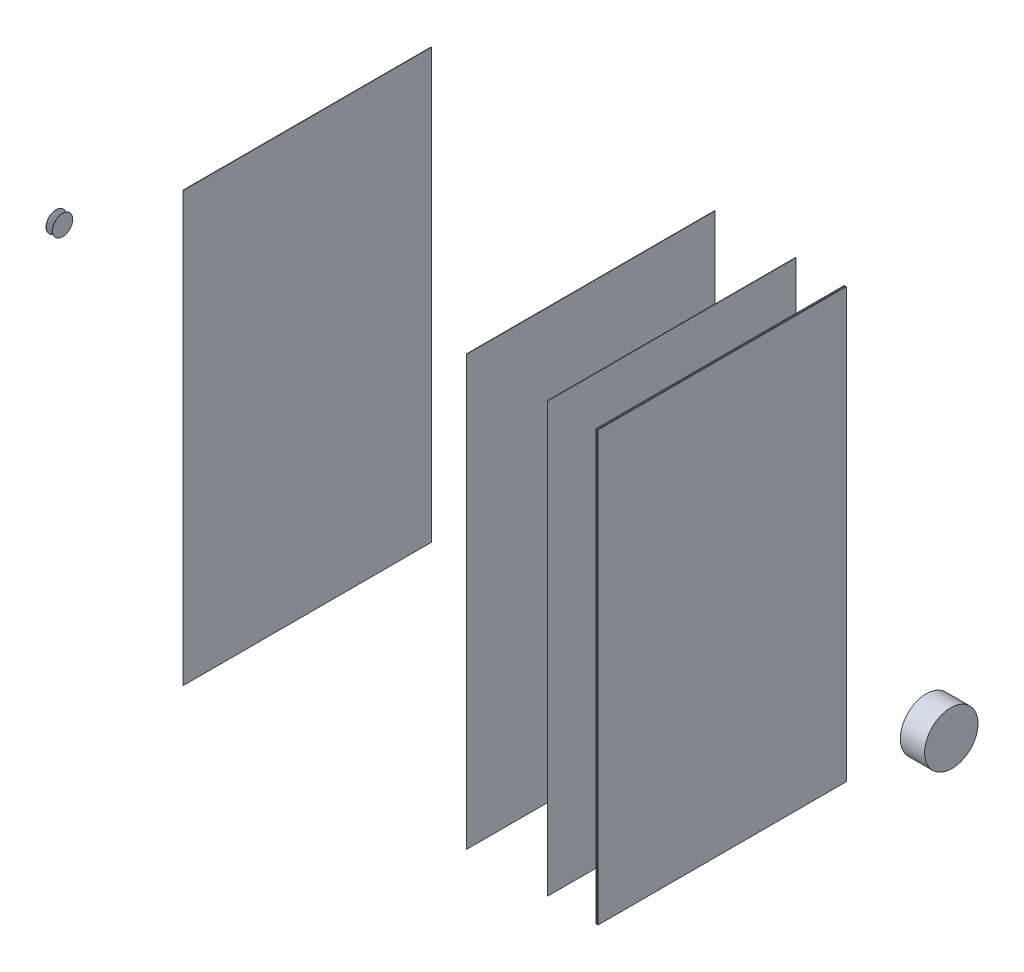
ISO-10303-21;
HEADER;
FILE_DESCRIPTION(('STEP AP214'),'2;1');
FILE_NAME('part.step','',(''),(''),'','','');
FILE_SCHEMA(('AUTOMOTIVE_DESIGN { 1 0 10303 214 1 1 1 1 }'));
ENDSEC;
DATA;
#1=APPLICATION_CONTEXT('core data for automotive mechanical design processes');
#2=APPLICATION_PROTOCOL_DEFINITION('international standard','automotive_design',2000,#1);
#3=PRODUCT_CONTEXT('',#1,'mechanical');
#4=PRODUCT('Part','Part','',(#3));
#5=PRODUCT_RELATED_PRODUCT_CATEGORY('part','',(#4));
#6=PRODUCT_DEFINITION_FORMATION('','',#4);
#7=PRODUCT_DEFINITION_CONTEXT('part definition',#1,'design');
#8=PRODUCT_DEFINITION('design','',#6,#7);
#9=PRODUCT_DEFINITION_SHAPE('','',#8);
#10=(LENGTH_UNIT() NAMED_UNIT(*) SI_UNIT(.MILLI.,.METRE.));
#11=(NAMED_UNIT(*) PLANE_ANGLE_UNIT() SI_UNIT($,.RADIAN.));
#12=(NAMED_UNIT(*) SI_UNIT($,.STERADIAN.) SOLID_ANGLE_UNIT());
#13=UNCERTAINTY_MEASURE_WITH_UNIT(LENGTH_MEASURE(1.E-05),#10,'distance_accuracy_value','');
#14=(GEOMETRIC_REPRESENTATION_CONTEXT(3) GLOBAL_UNCERTAINTY_ASSIGNED_CONTEXT((#13)) GLOBAL_UNIT_ASSIGNED_CONTEXT((#10,
#11,#12)) REPRESENTATION_CONTEXT('',''));
#15=CARTESIAN_POINT('',(0.,0.,0.));
#16=DIRECTION('',(0.,0.,1.));
#17=DIRECTION('',(1.,0.,0.));
#18=AXIS2_PLACEMENT_3D('',#15,#16,#17);
#19=CARTESIAN_POINT('',(1095.0318347031,14.9331197526062,14.9331197526767));
#20=DIRECTION('',(0.99981407984358,0.0136346203931999,0.0136346203932643));
#21=DIRECTION('',(0.0136358879275493,0.,-0.99990702695822));
#22=AXIS2_PLACEMENT_3D('',#19,#20,#21);
#23=PLANE('',#22);
#24=CARTESIAN_POINT('',(1095.43912526485,0.,0.));
#25=DIRECTION('',(0.99981407984358,0.0136346203932342,0.0136346203932342));
#26=DIRECTION('',(0.0136358879275192,0.,-0.999907026958221));
#27=AXIS2_PLACEMENT_3D('',#24,#25,#26);
#28=CIRCLE('',#27,32.5030219048135);
#29=CARTESIAN_POINT('',(1095.88233282885,0.,-32.5));
#30=VERTEX_POINT('',#29);
#31=EDGE_CURVE('E56',#30,#30,#28,.T.);
#32=ORIENTED_EDGE('',*,*,#31,.F.);
#33=EDGE_LOOP('',(#32));
#34=FACE_BOUND('',#33,.T.);
#35=ADVANCED_FACE('F50',(#34),#23,.F.);
#36=CARTESIAN_POINT('',(1125.0318347031,14.9331197526062,14.9331197526767));
#37=DIRECTION('',(0.99981407984358,0.0136346203931999,0.0136346203932643));
#38=DIRECTION('',(0.0136358879275493,0.,-0.99990702695822));
#39=AXIS2_PLACEMENT_3D('',#36,#37,#38);
#40=PLANE('',#39);
#41=CARTESIAN_POINT('',(1125.43912526485,0.,0.));
#42=DIRECTION('',(0.99981407984358,0.0136346203932342,0.0136346203932342));
#43=DIRECTION('',(0.0136358879275192,0.,-0.999907026958221));
#44=AXIS2_PLACEMENT_3D('',#41,#42,#43);
#45=CIRCLE('',#44,32.5030219048135);
#46=CARTESIAN_POINT('',(1125.88233282885,0.,-32.5));
#47=VERTEX_POINT('',#46);
#48=EDGE_CURVE('E12',#47,#47,#45,.T.);
#49=ORIENTED_EDGE('',*,*,#48,.T.);
#50=EDGE_LOOP('',(#49));
#51=FACE_BOUND('',#50,.T.);
#52=ADVANCED_FACE('F66',(#51),#40,.T.);
#53=DIRECTION('',(1.,0.,0.));
#54=VECTOR('',#53,1.);
#55=SURFACE_OF_LINEAR_EXTRUSION('',#28,#54);
#56=ORIENTED_EDGE('',*,*,#31,.T.);
#57=EDGE_LOOP('',(#56));
#58=FACE_BOUND('',#57,.T.);
#59=ORIENTED_EDGE('',*,*,#48,.F.);
#60=EDGE_LOOP('',(#59));
#61=FACE_BOUND('',#60,.T.);
#62=ADVANCED_FACE('F64',(#58,#61),#55,.T.);
#63=CLOSED_SHELL('',(#35,#52,#62));
#64=MANIFOLD_SOLID_BREP('B2',#63);
#65=CARTESIAN_POINT('',(842.495917700849,0.,0.));
#66=DIRECTION('',(1.,0.,0.));
#67=DIRECTION('',(0.,0.,-1.));
#68=AXIS2_PLACEMENT_3D('',#65,#66,#67);
#69=PLANE('',#68);
#70=DIRECTION('',(0.,1.,0.));
#71=VECTOR('',#70,1.);
#72=CARTESIAN_POINT('',(842.495917700849,-264.635,153.256));
#73=LINE('',#72,#71);
#74=CARTESIAN_POINT('',(842.495917700849,-264.635,153.256));
#75=VERTEX_POINT('',#74);
#76=CARTESIAN_POINT('',(842.495917700849,264.635,153.256));
#77=VERTEX_POINT('',#76);
#78=EDGE_CURVE('E111',#75,#77,#73,.T.);
#79=ORIENTED_EDGE('',*,*,#78,.F.);
#80=DIRECTION('',(0.,0.,1.));
#81=VECTOR('',#80,1.);
#82=CARTESIAN_POINT('',(842.495917700849,-264.635,153.256));
#83=LINE('',#82,#81);
#84=CARTESIAN_POINT('',(842.495917700849,-264.635,-153.256));
#85=VERTEX_POINT('',#84);
#86=EDGE_CURVE('E142',#85,#75,#83,.T.);
#87=ORIENTED_EDGE('',*,*,#86,.F.);
#88=DIRECTION('',(0.,-1.,0.));
#89=VECTOR('',#88,1.);
#90=CARTESIAN_POINT('',(842.495917700849,-264.635,-153.256));
#91=LINE('',#90,#89);
#92=CARTESIAN_POINT('',(842.495917700849,264.635,-153.256));
#93=VERTEX_POINT('',#92);
#94=EDGE_CURVE('E149',#93,#85,#91,.T.);
#95=ORIENTED_EDGE('',*,*,#94,.F.);
#96=DIRECTION('',(0.,0.,-1.));
#97=VECTOR('',#96,1.);
#98=CARTESIAN_POINT('',(842.495917700849,264.635,153.256));
#99=LINE('',#98,#97);
#100=EDGE_CURVE('E172',#77,#93,#99,.T.);
#101=ORIENTED_EDGE('',*,*,#100,.F.);
#102=EDGE_LOOP('',(#79,#87,#95,#101));
#103=FACE_BOUND('',#102,.T.);
#104=ADVANCED_FACE('F102',(#103),#69,.T.);
#105=CARTESIAN_POINT('',(841.995917700849,0.,0.));
#106=DIRECTION('',(1.,0.,0.));
#107=DIRECTION('',(0.,0.,-1.));
#108=AXIS2_PLACEMENT_3D('',#105,#106,#107);
#109=PLANE('',#108);
#110=DIRECTION('',(0.,1.,0.));
#111=VECTOR('',#110,1.);
#112=CARTESIAN_POINT('',(841.995917700849,-264.635,153.256));
#113=LINE('',#112,#111);
#114=CARTESIAN_POINT('',(841.995917700849,-264.635,153.256));
#115=VERTEX_POINT('',#114);
#116=CARTESIAN_POINT('',(841.995917700849,264.635,153.256));
#117=VERTEX_POINT('',#116);
#118=EDGE_CURVE('E48',#115,#117,#113,.T.);
#119=ORIENTED_EDGE('',*,*,#118,.T.);
#120=DIRECTION('',(0.,0.,-1.));
#121=VECTOR('',#120,1.);
#122=CARTESIAN_POINT('',(841.995917700849,264.635,153.256));
#123=LINE('',#122,#121);
#124=CARTESIAN_POINT('',(841.995917700849,264.635,-153.256));
#125=VERTEX_POINT('',#124);
#126=EDGE_CURVE('E120',#117,#125,#123,.T.);
#127=ORIENTED_EDGE('',*,*,#126,.T.);
#128=DIRECTION('',(0.,-1.,0.));
#129=VECTOR('',#128,1.);
#130=CARTESIAN_POINT('',(841.995917700849,-264.635,-153.256));
#131=LINE('',#130,#129);
#132=CARTESIAN_POINT('',(841.995917700849,-264.635,-153.256));
#133=VERTEX_POINT('',#132);
#134=EDGE_CURVE('E175',#125,#133,#131,.T.);
#135=ORIENTED_EDGE('',*,*,#134,.T.);
#136=DIRECTION('',(0.,0.,1.));
#137=VECTOR('',#136,1.);
#138=CARTESIAN_POINT('',(841.995917700849,-264.635,153.256));
#139=LINE('',#138,#137);
#140=EDGE_CURVE('E160',#133,#115,#139,.T.);
#141=ORIENTED_EDGE('',*,*,#140,.T.);
#142=EDGE_LOOP('',(#119,#127,#135,#141));
#143=FACE_BOUND('',#142,.T.);
#144=ADVANCED_FACE('F186',(#143),#109,.F.);
#145=CARTESIAN_POINT('',(841.995917700849,-264.635,153.256));
#146=DIRECTION('',(0.,1.,0.));
#147=DIRECTION('',(0.,0.,1.));
#148=AXIS2_PLACEMENT_3D('',#145,#146,#147);
#149=PLANE('',#148);
#150=ORIENTED_EDGE('',*,*,#86,.T.);
#151=DIRECTION('',(1.,0.,0.));
#152=VECTOR('',#151,1.);
#153=CARTESIAN_POINT('',(841.995917700849,-264.635,153.256));
#154=LINE('',#153,#152);
#155=EDGE_CURVE('E156',#115,#75,#154,.T.);
#156=ORIENTED_EDGE('',*,*,#155,.F.);
#157=ORIENTED_EDGE('',*,*,#140,.F.);
#158=DIRECTION('',(1.,0.,0.));
#159=VECTOR('',#158,1.);
#160=CARTESIAN_POINT('',(841.995917700849,-264.635,-153.256));
#161=LINE('',#160,#159);
#162=EDGE_CURVE('E151',#133,#85,#161,.T.);
#163=ORIENTED_EDGE('',*,*,#162,.T.);
#164=EDGE_LOOP('',(#150,#156,#157,#163));
#165=FACE_BOUND('',#164,.T.);
#166=ADVANCED_FACE('F158',(#165),#149,.F.);
#167=CARTESIAN_POINT('',(841.995917700849,-264.635,-153.256));
#168=DIRECTION('',(0.,0.,1.));
#169=DIRECTION('',(1.,0.,0.));
#170=AXIS2_PLACEMENT_3D('',#167,#168,#169);
#171=PLANE('',#170);
#172=ORIENTED_EDGE('',*,*,#94,.T.);
#173=ORIENTED_EDGE('',*,*,#162,.F.);
#174=ORIENTED_EDGE('',*,*,#134,.F.);
#175=DIRECTION('',(1.,0.,0.));
#176=VECTOR('',#175,1.);
#177=CARTESIAN_POINT('',(841.995917700849,264.635,-153.256));
#178=LINE('',#177,#176);
#179=EDGE_CURVE('E153',#125,#93,#178,.T.);
#180=ORIENTED_EDGE('',*,*,#179,.T.);
#181=EDGE_LOOP('',(#172,#173,#174,#180));
#182=FACE_BOUND('',#181,.T.);
#183=ADVANCED_FACE('F150',(#182),#171,.F.);
#184=CARTESIAN_POINT('',(841.995917700849,264.635,153.256));
#185=DIRECTION('',(0.,-1.,0.));
#186=DIRECTION('',(0.,0.,-1.));
#187=AXIS2_PLACEMENT_3D('',#184,#185,#186);
#188=PLANE('',#187);
#189=ORIENTED_EDGE('',*,*,#100,.T.);
#190=ORIENTED_EDGE('',*,*,#179,.F.);
#191=ORIENTED_EDGE('',*,*,#126,.F.);
#192=DIRECTION('',(1.,0.,0.));
#193=VECTOR('',#192,1.);
#194=CARTESIAN_POINT('',(841.995917700849,264.635,153.256));
#195=LINE('',#194,#193);
#196=EDGE_CURVE('E174',#117,#77,#195,.T.);
#197=ORIENTED_EDGE('',*,*,#196,.T.);
#198=EDGE_LOOP('',(#189,#190,#191,#197));
#199=FACE_BOUND('',#198,.T.);
#200=ADVANCED_FACE('F187',(#199),#188,.F.);
#201=CARTESIAN_POINT('',(841.995917700849,-264.635,153.256));
#202=DIRECTION('',(0.,0.,-1.));
#203=DIRECTION('',(0.,1.,0.));
#204=AXIS2_PLACEMENT_3D('',#201,#202,#203);
#205=PLANE('',#204);
#206=ORIENTED_EDGE('',*,*,#78,.T.);
#207=ORIENTED_EDGE('',*,*,#196,.F.);
#208=ORIENTED_EDGE('',*,*,#118,.F.);
#209=ORIENTED_EDGE('',*,*,#155,.T.);
#210=EDGE_LOOP('',(#206,#207,#208,#209));
#211=FACE_BOUND('',#210,.T.);
#212=ADVANCED_FACE('F200',(#211),#205,.F.);
#213=CLOSED_SHELL('',(#104,#144,#166,#183,#200,#212));
#214=MANIFOLD_SOLID_BREP('B7',#213);
#215=CARTESIAN_POINT('',(680.495917700849,0.,0.));
#216=DIRECTION('',(1.,0.,0.));
#217=DIRECTION('',(0.,0.,-1.));
#218=AXIS2_PLACEMENT_3D('',#215,#216,#217);
#219=PLANE('',#218);
#220=DIRECTION('',(0.,-1.,0.));
#221=VECTOR('',#220,1.);
#222=CARTESIAN_POINT('',(680.495917700849,-264.635,153.256));
#223=LINE('',#222,#221);
#224=CARTESIAN_POINT('',(680.495917700849,264.635,153.256));
#225=VERTEX_POINT('',#224);
#226=CARTESIAN_POINT('',(680.495917700849,-264.635,153.256));
#227=VERTEX_POINT('',#226);
#228=EDGE_CURVE('E297',#225,#227,#223,.T.);
#229=ORIENTED_EDGE('',*,*,#228,.T.);
#230=DIRECTION('',(0.,0.,-1.));
#231=VECTOR('',#230,1.);
#232=CARTESIAN_POINT('',(680.495917700849,-264.635,153.256));
#233=LINE('',#232,#231);
#234=CARTESIAN_POINT('',(680.495917700849,-264.635,-153.256));
#235=VERTEX_POINT('',#234);
#236=EDGE_CURVE('E269',#227,#235,#233,.T.);
#237=ORIENTED_EDGE('',*,*,#236,.T.);
#238=DIRECTION('',(0.,1.,0.));
#239=VECTOR('',#238,1.);
#240=CARTESIAN_POINT('',(680.495917700849,-264.635,-153.256));
#241=LINE('',#240,#239);
#242=CARTESIAN_POINT('',(680.495917700849,264.635,-153.256));
#243=VERTEX_POINT('',#242);
#244=EDGE_CURVE('E303',#235,#243,#241,.T.);
#245=ORIENTED_EDGE('',*,*,#244,.T.);
#246=DIRECTION('',(0.,0.,1.));
#247=VECTOR('',#246,1.);
#248=CARTESIAN_POINT('',(680.495917700849,264.635,153.256));
#249=LINE('',#248,#247);
#250=EDGE_CURVE('E300',#243,#225,#249,.T.);
#251=ORIENTED_EDGE('',*,*,#250,.T.);
#252=EDGE_LOOP('',(#229,#237,#245,#251));
#253=FACE_BOUND('',#252,.T.);
#254=ADVANCED_FACE('F260',(#253),#219,.T.);
#255=CARTESIAN_POINT('',(679.995917700849,0.,0.));
#256=DIRECTION('',(1.,0.,0.));
#257=DIRECTION('',(0.,0.,-1.));
#258=AXIS2_PLACEMENT_3D('',#255,#256,#257);
#259=PLANE('',#258);
#260=DIRECTION('',(0.,-1.,0.));
#261=VECTOR('',#260,1.);
#262=CARTESIAN_POINT('',(679.995917700849,-264.635,153.256));
#263=LINE('',#262,#261);
#264=CARTESIAN_POINT('',(679.995917700849,264.635,153.256));
#265=VERTEX_POINT('',#264);
#266=CARTESIAN_POINT('',(679.995917700849,-264.635,153.256));
#267=VERTEX_POINT('',#266);
#268=EDGE_CURVE('E317',#265,#267,#263,.T.);
#269=ORIENTED_EDGE('',*,*,#268,.F.);
#270=DIRECTION('',(0.,0.,1.));
#271=VECTOR('',#270,1.);
#272=CARTESIAN_POINT('',(679.995917700849,264.635,153.256));
#273=LINE('',#272,#271);
#274=CARTESIAN_POINT('',(679.995917700849,264.635,-153.256));
#275=VERTEX_POINT('',#274);
#276=EDGE_CURVE('E314',#275,#265,#273,.T.);
#277=ORIENTED_EDGE('',*,*,#276,.F.);
#278=DIRECTION('',(0.,1.,0.));
#279=VECTOR('',#278,1.);
#280=CARTESIAN_POINT('',(679.995917700849,-264.635,-153.256));
#281=LINE('',#280,#279);
#282=CARTESIAN_POINT('',(679.995917700849,-264.635,-153.256));
#283=VERTEX_POINT('',#282);
#284=EDGE_CURVE('E278',#283,#275,#281,.T.);
#285=ORIENTED_EDGE('',*,*,#284,.F.);
#286=DIRECTION('',(0.,0.,-1.));
#287=VECTOR('',#286,1.);
#288=CARTESIAN_POINT('',(679.995917700849,-264.635,153.256));
#289=LINE('',#288,#287);
#290=EDGE_CURVE('E100',#267,#283,#289,.T.);
#291=ORIENTED_EDGE('',*,*,#290,.F.);
#292=EDGE_LOOP('',(#269,#277,#285,#291));
#293=FACE_BOUND('',#292,.T.);
#294=ADVANCED_FACE('F356',(#293),#259,.F.);
#295=CARTESIAN_POINT('',(679.995917700849,-264.635,153.256));
#296=DIRECTION('',(0.,0.,1.));
#297=DIRECTION('',(1.,0.,0.));
#298=AXIS2_PLACEMENT_3D('',#295,#296,#297);
#299=PLANE('',#298);
#300=ORIENTED_EDGE('',*,*,#228,.F.);
#301=DIRECTION('',(1.,0.,0.));
#302=VECTOR('',#301,1.);
#303=CARTESIAN_POINT('',(679.995917700849,264.635,153.256));
#304=LINE('',#303,#302);
#305=EDGE_CURVE('E312',#265,#225,#304,.T.);
#306=ORIENTED_EDGE('',*,*,#305,.F.);
#307=ORIENTED_EDGE('',*,*,#268,.T.);
#308=DIRECTION('',(1.,0.,0.));
#309=VECTOR('',#308,1.);
#310=CARTESIAN_POINT('',(679.995917700849,-264.635,153.256));
#311=LINE('',#310,#309);
#312=EDGE_CURVE('E308',#267,#227,#311,.T.);
#313=ORIENTED_EDGE('',*,*,#312,.T.);
#314=EDGE_LOOP('',(#300,#306,#307,#313));
#315=FACE_BOUND('',#314,.T.);
#316=ADVANCED_FACE('F318',(#315),#299,.T.);
#317=CARTESIAN_POINT('',(679.995917700849,264.635,153.256));
#318=DIRECTION('',(0.,1.,0.));
#319=DIRECTION('',(0.,0.,1.));
#320=AXIS2_PLACEMENT_3D('',#317,#318,#319);
#321=PLANE('',#320);
#322=ORIENTED_EDGE('',*,*,#250,.F.);
#323=DIRECTION('',(1.,0.,0.));
#324=VECTOR('',#323,1.);
#325=CARTESIAN_POINT('',(679.995917700849,264.635,-153.256));
#326=LINE('',#325,#324);
#327=EDGE_CURVE('E307',#275,#243,#326,.T.);
#328=ORIENTED_EDGE('',*,*,#327,.F.);
#329=ORIENTED_EDGE('',*,*,#276,.T.);
#330=ORIENTED_EDGE('',*,*,#305,.T.);
#331=EDGE_LOOP('',(#322,#328,#329,#330));
#332=FACE_BOUND('',#331,.T.);
#333=ADVANCED_FACE('F313',(#332),#321,.T.);
#334=CARTESIAN_POINT('',(679.995917700849,-264.635,-153.256));
#335=DIRECTION('',(0.,0.,-1.));
#336=DIRECTION('',(0.,1.,0.));
#337=AXIS2_PLACEMENT_3D('',#334,#335,#336);
#338=PLANE('',#337);
#339=ORIENTED_EDGE('',*,*,#244,.F.);
#340=DIRECTION('',(1.,0.,0.));
#341=VECTOR('',#340,1.);
#342=CARTESIAN_POINT('',(679.995917700849,-264.635,-153.256));
#343=LINE('',#342,#341);
#344=EDGE_CURVE('E332',#283,#235,#343,.T.);
#345=ORIENTED_EDGE('',*,*,#344,.F.);
#346=ORIENTED_EDGE('',*,*,#284,.T.);
#347=ORIENTED_EDGE('',*,*,#327,.T.);
#348=EDGE_LOOP('',(#339,#345,#346,#347));
#349=FACE_BOUND('',#348,.T.);
#350=ADVANCED_FACE('F343',(#349),#338,.T.);
#351=CARTESIAN_POINT('',(679.995917700849,-264.635,153.256));
#352=DIRECTION('',(0.,-1.,0.));
#353=DIRECTION('',(0.,0.,-1.));
#354=AXIS2_PLACEMENT_3D('',#351,#352,#353);
#355=PLANE('',#354);
#356=ORIENTED_EDGE('',*,*,#236,.F.);
#357=ORIENTED_EDGE('',*,*,#312,.F.);
#358=ORIENTED_EDGE('',*,*,#290,.T.);
#359=ORIENTED_EDGE('',*,*,#344,.T.);
#360=EDGE_LOOP('',(#356,#357,#358,#359));
#361=FACE_BOUND('',#360,.T.);
#362=ADVANCED_FACE('F358',(#361),#355,.T.);
#363=CLOSED_SHELL('',(#254,#294,#316,#333,#350,#362));
#364=MANIFOLD_SOLID_BREP('B42',#363);
#365=CARTESIAN_POINT('',(780.495917700849,0.,0.));
#366=DIRECTION('',(1.,0.,0.));
#367=DIRECTION('',(0.,0.,-1.));
#368=AXIS2_PLACEMENT_3D('',#365,#366,#367);
#369=PLANE('',#368);
#370=DIRECTION('',(0.,-1.,0.));
#371=VECTOR('',#370,1.);
#372=CARTESIAN_POINT('',(780.495917700849,-264.635,153.256));
#373=LINE('',#372,#371);
#374=CARTESIAN_POINT('',(780.495917700849,264.635,153.256));
#375=VERTEX_POINT('',#374);
#376=CARTESIAN_POINT('',(780.495917700849,-264.635,153.256));
#377=VERTEX_POINT('',#376);
#378=EDGE_CURVE('E455',#375,#377,#373,.T.);
#379=ORIENTED_EDGE('',*,*,#378,.T.);
#380=DIRECTION('',(0.,0.,-1.));
#381=VECTOR('',#380,1.);
#382=CARTESIAN_POINT('',(780.495917700849,-264.635,153.256));
#383=LINE('',#382,#381);
#384=CARTESIAN_POINT('',(780.495917700849,-264.635,-153.256));
#385=VERTEX_POINT('',#384);
#386=EDGE_CURVE('E427',#377,#385,#383,.T.);
#387=ORIENTED_EDGE('',*,*,#386,.T.);
#388=DIRECTION('',(0.,1.,0.));
#389=VECTOR('',#388,1.);
#390=CARTESIAN_POINT('',(780.495917700849,-264.635,-153.256));
#391=LINE('',#390,#389);
#392=CARTESIAN_POINT('',(780.495917700849,264.635,-153.256));
#393=VERTEX_POINT('',#392);
#394=EDGE_CURVE('E461',#385,#393,#391,.T.);
#395=ORIENTED_EDGE('',*,*,#394,.T.);
#396=DIRECTION('',(0.,0.,1.));
#397=VECTOR('',#396,1.);
#398=CARTESIAN_POINT('',(780.495917700849,264.635,153.256));
#399=LINE('',#398,#397);
#400=EDGE_CURVE('E458',#393,#375,#399,.T.);
#401=ORIENTED_EDGE('',*,*,#400,.T.);
#402=EDGE_LOOP('',(#379,#387,#395,#401));
#403=FACE_BOUND('',#402,.T.);
#404=ADVANCED_FACE('F418',(#403),#369,.T.);
#405=CARTESIAN_POINT('',(779.995917700849,0.,0.));
#406=DIRECTION('',(1.,0.,0.));
#407=DIRECTION('',(0.,0.,-1.));
#408=AXIS2_PLACEMENT_3D('',#405,#406,#407);
#409=PLANE('',#408);
#410=DIRECTION('',(0.,-1.,0.));
#411=VECTOR('',#410,1.);
#412=CARTESIAN_POINT('',(779.995917700849,-264.635,153.256));
#413=LINE('',#412,#411);
#414=CARTESIAN_POINT('',(779.995917700849,264.635,153.256));
#415=VERTEX_POINT('',#414);
#416=CARTESIAN_POINT('',(779.995917700849,-264.635,153.256));
#417=VERTEX_POINT('',#416);
#418=EDGE_CURVE('E475',#415,#417,#413,.T.);
#419=ORIENTED_EDGE('',*,*,#418,.F.);
#420=DIRECTION('',(0.,0.,1.));
#421=VECTOR('',#420,1.);
#422=CARTESIAN_POINT('',(779.995917700849,264.635,153.256));
#423=LINE('',#422,#421);
#424=CARTESIAN_POINT('',(779.995917700849,264.635,-153.256));
#425=VERTEX_POINT('',#424);
#426=EDGE_CURVE('E472',#425,#415,#423,.T.);
#427=ORIENTED_EDGE('',*,*,#426,.F.);
#428=DIRECTION('',(0.,1.,0.));
#429=VECTOR('',#428,1.);
#430=CARTESIAN_POINT('',(779.995917700849,-264.635,-153.256));
#431=LINE('',#430,#429);
#432=CARTESIAN_POINT('',(779.995917700849,-264.635,-153.256));
#433=VERTEX_POINT('',#432);
#434=EDGE_CURVE('E436',#433,#425,#431,.T.);
#435=ORIENTED_EDGE('',*,*,#434,.F.);
#436=DIRECTION('',(0.,0.,-1.));
#437=VECTOR('',#436,1.);
#438=CARTESIAN_POINT('',(779.995917700849,-264.635,153.256));
#439=LINE('',#438,#437);
#440=EDGE_CURVE('E258',#417,#433,#439,.T.);
#441=ORIENTED_EDGE('',*,*,#440,.F.);
#442=EDGE_LOOP('',(#419,#427,#435,#441));
#443=FACE_BOUND('',#442,.T.);
#444=ADVANCED_FACE('F514',(#443),#409,.F.);
#445=CARTESIAN_POINT('',(779.995917700849,-264.635,153.256));
#446=DIRECTION('',(0.,0.,1.));
#447=DIRECTION('',(1.,0.,0.));
#448=AXIS2_PLACEMENT_3D('',#445,#446,#447);
#449=PLANE('',#448);
#450=ORIENTED_EDGE('',*,*,#378,.F.);
#451=DIRECTION('',(1.,0.,0.));
#452=VECTOR('',#451,1.);
#453=CARTESIAN_POINT('',(779.995917700849,264.635,153.256));
#454=LINE('',#453,#452);
#455=EDGE_CURVE('E470',#415,#375,#454,.T.);
#456=ORIENTED_EDGE('',*,*,#455,.F.);
#457=ORIENTED_EDGE('',*,*,#418,.T.);
#458=DIRECTION('',(1.,0.,0.));
#459=VECTOR('',#458,1.);
#460=CARTESIAN_POINT('',(779.995917700849,-264.635,153.256));
#461=LINE('',#460,#459);
#462=EDGE_CURVE('E466',#417,#377,#461,.T.);
#463=ORIENTED_EDGE('',*,*,#462,.T.);
#464=EDGE_LOOP('',(#450,#456,#457,#463));
#465=FACE_BOUND('',#464,.T.);
#466=ADVANCED_FACE('F476',(#465),#449,.T.);
#467=CARTESIAN_POINT('',(779.995917700849,264.635,153.256));
#468=DIRECTION('',(0.,1.,0.));
#469=DIRECTION('',(0.,0.,1.));
#470=AXIS2_PLACEMENT_3D('',#467,#468,#469);
#471=PLANE('',#470);
#472=ORIENTED_EDGE('',*,*,#400,.F.);
#473=DIRECTION('',(1.,0.,0.));
#474=VECTOR('',#473,1.);
#475=CARTESIAN_POINT('',(779.995917700849,264.635,-153.256));
#476=LINE('',#475,#474);
#477=EDGE_CURVE('E465',#425,#393,#476,.T.);
#478=ORIENTED_EDGE('',*,*,#477,.F.);
#479=ORIENTED_EDGE('',*,*,#426,.T.);
#480=ORIENTED_EDGE('',*,*,#455,.T.);
#481=EDGE_LOOP('',(#472,#478,#479,#480));
#482=FACE_BOUND('',#481,.T.);
#483=ADVANCED_FACE('F471',(#482),#471,.T.);
#484=CARTESIAN_POINT('',(779.995917700849,-264.635,-153.256));
#485=DIRECTION('',(0.,0.,-1.));
#486=DIRECTION('',(-1.,0.,0.));
#487=AXIS2_PLACEMENT_3D('',#484,#485,#486);
#488=PLANE('',#487);
#489=ORIENTED_EDGE('',*,*,#394,.F.);
#490=DIRECTION('',(1.,0.,0.));
#491=VECTOR('',#490,1.);
#492=CARTESIAN_POINT('',(779.995917700849,-264.635,-153.256));
#493=LINE('',#492,#491);
#494=EDGE_CURVE('E490',#433,#385,#493,.T.);
#495=ORIENTED_EDGE('',*,*,#494,.F.);
#496=ORIENTED_EDGE('',*,*,#434,.T.);
#497=ORIENTED_EDGE('',*,*,#477,.T.);
#498=EDGE_LOOP('',(#489,#495,#496,#497));
#499=FACE_BOUND('',#498,.T.);
#500=ADVANCED_FACE('F501',(#499),#488,.T.);
#501=CARTESIAN_POINT('',(779.995917700849,-264.635,153.256));
#502=DIRECTION('',(0.,-1.,0.));
#503=DIRECTION('',(0.,0.,-1.));
#504=AXIS2_PLACEMENT_3D('',#501,#502,#503);
#505=PLANE('',#504);
#506=ORIENTED_EDGE('',*,*,#386,.F.);
#507=ORIENTED_EDGE('',*,*,#462,.F.);
#508=ORIENTED_EDGE('',*,*,#440,.T.);
#509=ORIENTED_EDGE('',*,*,#494,.T.);
#510=EDGE_LOOP('',(#506,#507,#508,#509));
#511=FACE_BOUND('',#510,.T.);
#512=ADVANCED_FACE('F516',(#511),#505,.T.);
#513=CLOSED_SHELL('',(#404,#444,#466,#483,#500,#512));
#514=MANIFOLD_SOLID_BREP('B94',#513);
#515=CARTESIAN_POINT('',(330.495917700849,0.,0.));
#516=DIRECTION('',(1.,0.,0.));
#517=DIRECTION('',(0.,0.,-1.));
#518=AXIS2_PLACEMENT_3D('',#515,#516,#517);
#519=PLANE('',#518);
#520=DIRECTION('',(0.,-1.,0.));
#521=VECTOR('',#520,1.);
#522=CARTESIAN_POINT('',(330.495917700849,-264.635,153.256));
#523=LINE('',#522,#521);
#524=CARTESIAN_POINT('',(330.495917700849,264.635,153.256));
#525=VERTEX_POINT('',#524);
#526=CARTESIAN_POINT('',(330.495917700849,-264.635,153.256));
#527=VERTEX_POINT('',#526);
#528=EDGE_CURVE('E613',#525,#527,#523,.T.);
#529=ORIENTED_EDGE('',*,*,#528,.T.);
#530=DIRECTION('',(0.,0.,-1.));
#531=VECTOR('',#530,1.);
#532=CARTESIAN_POINT('',(330.495917700849,-264.635,153.256));
#533=LINE('',#532,#531);
#534=CARTESIAN_POINT('',(330.495917700849,-264.635,-153.256));
#535=VERTEX_POINT('',#534);
#536=EDGE_CURVE('E585',#527,#535,#533,.T.);
#537=ORIENTED_EDGE('',*,*,#536,.T.);
#538=DIRECTION('',(0.,1.,0.));
#539=VECTOR('',#538,1.);
#540=CARTESIAN_POINT('',(330.495917700849,-264.635,-153.256));
#541=LINE('',#540,#539);
#542=CARTESIAN_POINT('',(330.495917700849,264.635,-153.256));
#543=VERTEX_POINT('',#542);
#544=EDGE_CURVE('E619',#535,#543,#541,.T.);
#545=ORIENTED_EDGE('',*,*,#544,.T.);
#546=DIRECTION('',(0.,0.,1.));
#547=VECTOR('',#546,1.);
#548=CARTESIAN_POINT('',(330.495917700849,264.635,153.256));
#549=LINE('',#548,#547);
#550=EDGE_CURVE('E616',#543,#525,#549,.T.);
#551=ORIENTED_EDGE('',*,*,#550,.T.);
#552=EDGE_LOOP('',(#529,#537,#545,#551));
#553=FACE_BOUND('',#552,.T.);
#554=ADVANCED_FACE('F576',(#553),#519,.T.);
#555=CARTESIAN_POINT('',(329.995917700849,0.,0.));
#556=DIRECTION('',(1.,0.,0.));
#557=DIRECTION('',(0.,0.,-1.));
#558=AXIS2_PLACEMENT_3D('',#555,#556,#557);
#559=PLANE('',#558);
#560=DIRECTION('',(0.,-1.,0.));
#561=VECTOR('',#560,1.);
#562=CARTESIAN_POINT('',(329.995917700849,-264.635,153.256));
#563=LINE('',#562,#561);
#564=CARTESIAN_POINT('',(329.995917700849,264.635,153.256));
#565=VERTEX_POINT('',#564);
#566=CARTESIAN_POINT('',(329.995917700849,-264.635,153.256));
#567=VERTEX_POINT('',#566);
#568=EDGE_CURVE('E633',#565,#567,#563,.T.);
#569=ORIENTED_EDGE('',*,*,#568,.F.);
#570=DIRECTION('',(0.,0.,1.));
#571=VECTOR('',#570,1.);
#572=CARTESIAN_POINT('',(329.995917700849,264.635,153.256));
#573=LINE('',#572,#571);
#574=CARTESIAN_POINT('',(329.995917700849,264.635,-153.256));
#575=VERTEX_POINT('',#574);
#576=EDGE_CURVE('E630',#575,#565,#573,.T.);
#577=ORIENTED_EDGE('',*,*,#576,.F.);
#578=DIRECTION('',(0.,1.,0.));
#579=VECTOR('',#578,1.);
#580=CARTESIAN_POINT('',(329.995917700849,-264.635,-153.256));
#581=LINE('',#580,#579);
#582=CARTESIAN_POINT('',(329.995917700849,-264.635,-153.256));
#583=VERTEX_POINT('',#582);
#584=EDGE_CURVE('E594',#583,#575,#581,.T.);
#585=ORIENTED_EDGE('',*,*,#584,.F.);
#586=DIRECTION('',(0.,0.,-1.));
#587=VECTOR('',#586,1.);
#588=CARTESIAN_POINT('',(329.995917700849,-264.635,153.256));
#589=LINE('',#588,#587);
#590=EDGE_CURVE('E416',#567,#583,#589,.T.);
#591=ORIENTED_EDGE('',*,*,#590,.F.);
#592=EDGE_LOOP('',(#569,#577,#585,#591));
#593=FACE_BOUND('',#592,.T.);
#594=ADVANCED_FACE('F672',(#593),#559,.F.);
#595=CARTESIAN_POINT('',(329.995917700849,-264.635,153.256));
#596=DIRECTION('',(0.,0.,1.));
#597=DIRECTION('',(0.,-1.,0.));
#598=AXIS2_PLACEMENT_3D('',#595,#596,#597);
#599=PLANE('',#598);
#600=ORIENTED_EDGE('',*,*,#528,.F.);
#601=DIRECTION('',(1.,0.,0.));
#602=VECTOR('',#601,1.);
#603=CARTESIAN_POINT('',(329.995917700849,264.635,153.256));
#604=LINE('',#603,#602);
#605=EDGE_CURVE('E628',#565,#525,#604,.T.);
#606=ORIENTED_EDGE('',*,*,#605,.F.);
#607=ORIENTED_EDGE('',*,*,#568,.T.);
#608=DIRECTION('',(1.,0.,0.));
#609=VECTOR('',#608,1.);
#610=CARTESIAN_POINT('',(329.995917700849,-264.635,153.256));
#611=LINE('',#610,#609);
#612=EDGE_CURVE('E624',#567,#527,#611,.T.);
#613=ORIENTED_EDGE('',*,*,#612,.T.);
#614=EDGE_LOOP('',(#600,#606,#607,#613));
#615=FACE_BOUND('',#614,.T.);
#616=ADVANCED_FACE('F634',(#615),#599,.T.);
#617=CARTESIAN_POINT('',(329.995917700849,264.635,153.256));
#618=DIRECTION('',(0.,1.,0.));
#619=DIRECTION('',(0.,0.,1.));
#620=AXIS2_PLACEMENT_3D('',#617,#618,#619);
#621=PLANE('',#620);
#622=ORIENTED_EDGE('',*,*,#550,.F.);
#623=DIRECTION('',(1.,0.,0.));
#624=VECTOR('',#623,1.);
#625=CARTESIAN_POINT('',(329.995917700849,264.635,-153.256));
#626=LINE('',#625,#624);
#627=EDGE_CURVE('E623',#575,#543,#626,.T.);
#628=ORIENTED_EDGE('',*,*,#627,.F.);
#629=ORIENTED_EDGE('',*,*,#576,.T.);
#630=ORIENTED_EDGE('',*,*,#605,.T.);
#631=EDGE_LOOP('',(#622,#628,#629,#630));
#632=FACE_BOUND('',#631,.T.);
#633=ADVANCED_FACE('F629',(#632),#621,.T.);
#634=CARTESIAN_POINT('',(329.995917700849,-264.635,-153.256));
#635=DIRECTION('',(0.,0.,-1.));
#636=DIRECTION('',(-1.,0.,0.));
#637=AXIS2_PLACEMENT_3D('',#634,#635,#636);
#638=PLANE('',#637);
#639=ORIENTED_EDGE('',*,*,#544,.F.);
#640=DIRECTION('',(1.,0.,0.));
#641=VECTOR('',#640,1.);
#642=CARTESIAN_POINT('',(329.995917700849,-264.635,-153.256));
#643=LINE('',#642,#641);
#644=EDGE_CURVE('E648',#583,#535,#643,.T.);
#645=ORIENTED_EDGE('',*,*,#644,.F.);
#646=ORIENTED_EDGE('',*,*,#584,.T.);
#647=ORIENTED_EDGE('',*,*,#627,.T.);
#648=EDGE_LOOP('',(#639,#645,#646,#647));
#649=FACE_BOUND('',#648,.T.);
#650=ADVANCED_FACE('F659',(#649),#638,.T.);
#651=CARTESIAN_POINT('',(329.995917700849,-264.635,153.256));
#652=DIRECTION('',(0.,-1.,0.));
#653=DIRECTION('',(0.,0.,-1.));
#654=AXIS2_PLACEMENT_3D('',#651,#652,#653);
#655=PLANE('',#654);
#656=ORIENTED_EDGE('',*,*,#536,.F.);
#657=ORIENTED_EDGE('',*,*,#612,.F.);
#658=ORIENTED_EDGE('',*,*,#590,.T.);
#659=ORIENTED_EDGE('',*,*,#644,.T.);
#660=EDGE_LOOP('',(#656,#657,#658,#659));
#661=FACE_BOUND('',#660,.T.);
#662=ADVANCED_FACE('F674',(#661),#655,.T.);
#663=CLOSED_SHELL('',(#554,#594,#616,#633,#650,#662));
#664=MANIFOLD_SOLID_BREP('B252',#663);
#665=CARTESIAN_POINT('',(840.495917700849,0.,0.));
#666=DIRECTION('',(1.,0.,0.));
#667=DIRECTION('',(0.,0.,-1.));
#668=AXIS2_PLACEMENT_3D('',#665,#666,#667);
#669=PLANE('',#668);
#670=DIRECTION('',(0.,-1.,0.));
#671=VECTOR('',#670,1.);
#672=CARTESIAN_POINT('',(840.495917700849,-264.635,153.256));
#673=LINE('',#672,#671);
#674=CARTESIAN_POINT('',(840.495917700849,264.635,153.256));
#675=VERTEX_POINT('',#674);
#676=CARTESIAN_POINT('',(840.495917700849,-264.635,153.256));
#677=VERTEX_POINT('',#676);
#678=EDGE_CURVE('E769',#675,#677,#673,.T.);
#679=ORIENTED_EDGE('',*,*,#678,.T.);
#680=DIRECTION('',(0.,0.,-1.));
#681=VECTOR('',#680,1.);
#682=CARTESIAN_POINT('',(840.495917700849,-264.635,153.256));
#683=LINE('',#682,#681);
#684=CARTESIAN_POINT('',(840.495917700849,-264.635,-153.256));
#685=VERTEX_POINT('',#684);
#686=EDGE_CURVE('E741',#677,#685,#683,.T.);
#687=ORIENTED_EDGE('',*,*,#686,.T.);
#688=DIRECTION('',(0.,1.,0.));
#689=VECTOR('',#688,1.);
#690=CARTESIAN_POINT('',(840.495917700849,-264.635,-153.256));
#691=LINE('',#690,#689);
#692=CARTESIAN_POINT('',(840.495917700849,264.635,-153.256));
#693=VERTEX_POINT('',#692);
#694=EDGE_CURVE('E775',#685,#693,#691,.T.);
#695=ORIENTED_EDGE('',*,*,#694,.T.);
#696=DIRECTION('',(0.,0.,1.));
#697=VECTOR('',#696,1.);
#698=CARTESIAN_POINT('',(840.495917700849,264.635,153.256));
#699=LINE('',#698,#697);
#700=EDGE_CURVE('E772',#693,#675,#699,.T.);
#701=ORIENTED_EDGE('',*,*,#700,.T.);
#702=EDGE_LOOP('',(#679,#687,#695,#701));
#703=FACE_BOUND('',#702,.T.);
#704=ADVANCED_FACE('F732',(#703),#669,.T.);
#705=CARTESIAN_POINT('',(839.995917700849,0.,0.));
#706=DIRECTION('',(1.,0.,0.));
#707=DIRECTION('',(0.,0.,-1.));
#708=AXIS2_PLACEMENT_3D('',#705,#706,#707);
#709=PLANE('',#708);
#710=DIRECTION('',(0.,-1.,0.));
#711=VECTOR('',#710,1.);
#712=CARTESIAN_POINT('',(839.995917700849,-264.635,153.256));
#713=LINE('',#712,#711);
#714=CARTESIAN_POINT('',(839.995917700849,264.635,153.256));
#715=VERTEX_POINT('',#714);
#716=CARTESIAN_POINT('',(839.995917700849,-264.635,153.256));
#717=VERTEX_POINT('',#716);
#718=EDGE_CURVE('E789',#715,#717,#713,.T.);
#719=ORIENTED_EDGE('',*,*,#718,.F.);
#720=DIRECTION('',(0.,0.,1.));
#721=VECTOR('',#720,1.);
#722=CARTESIAN_POINT('',(839.995917700849,264.635,153.256));
#723=LINE('',#722,#721);
#724=CARTESIAN_POINT('',(839.995917700849,264.635,-153.256));
#725=VERTEX_POINT('',#724);
#726=EDGE_CURVE('E786',#725,#715,#723,.T.);
#727=ORIENTED_EDGE('',*,*,#726,.F.);
#728=DIRECTION('',(0.,1.,0.));
#729=VECTOR('',#728,1.);
#730=CARTESIAN_POINT('',(839.995917700849,-264.635,-153.256));
#731=LINE('',#730,#729);
#732=CARTESIAN_POINT('',(839.995917700849,-264.635,-153.256));
#733=VERTEX_POINT('',#732);
#734=EDGE_CURVE('E750',#733,#725,#731,.T.);
#735=ORIENTED_EDGE('',*,*,#734,.F.);
#736=DIRECTION('',(0.,0.,-1.));
#737=VECTOR('',#736,1.);
#738=CARTESIAN_POINT('',(839.995917700849,-264.635,153.256));
#739=LINE('',#738,#737);
#740=EDGE_CURVE('E574',#717,#733,#739,.T.);
#741=ORIENTED_EDGE('',*,*,#740,.F.);
#742=EDGE_LOOP('',(#719,#727,#735,#741));
#743=FACE_BOUND('',#742,.T.);
#744=ADVANCED_FACE('F828',(#743),#709,.F.);
#745=CARTESIAN_POINT('',(839.995917700849,-264.635,153.256));
#746=DIRECTION('',(0.,0.,1.));
#747=DIRECTION('',(1.,0.,0.));
#748=AXIS2_PLACEMENT_3D('',#745,#746,#747);
#749=PLANE('',#748);
#750=ORIENTED_EDGE('',*,*,#678,.F.);
#751=DIRECTION('',(1.,0.,0.));
#752=VECTOR('',#751,1.);
#753=CARTESIAN_POINT('',(839.995917700849,264.635,153.256));
#754=LINE('',#753,#752);
#755=EDGE_CURVE('E784',#715,#675,#754,.T.);
#756=ORIENTED_EDGE('',*,*,#755,.F.);
#757=ORIENTED_EDGE('',*,*,#718,.T.);
#758=DIRECTION('',(1.,0.,0.));
#759=VECTOR('',#758,1.);
#760=CARTESIAN_POINT('',(839.995917700849,-264.635,153.256));
#761=LINE('',#760,#759);
#762=EDGE_CURVE('E780',#717,#677,#761,.T.);
#763=ORIENTED_EDGE('',*,*,#762,.T.);
#764=EDGE_LOOP('',(#750,#756,#757,#763));
#765=FACE_BOUND('',#764,.T.);
#766=ADVANCED_FACE('F790',(#765),#749,.T.);
#767=CARTESIAN_POINT('',(839.995917700849,264.635,153.256));
#768=DIRECTION('',(0.,1.,0.));
#769=DIRECTION('',(0.,0.,1.));
#770=AXIS2_PLACEMENT_3D('',#767,#768,#769);
#771=PLANE('',#770);
#772=ORIENTED_EDGE('',*,*,#700,.F.);
#773=DIRECTION('',(1.,0.,0.));
#774=VECTOR('',#773,1.);
#775=CARTESIAN_POINT('',(839.995917700849,264.635,-153.256));
#776=LINE('',#775,#774);
#777=EDGE_CURVE('E779',#725,#693,#776,.T.);
#778=ORIENTED_EDGE('',*,*,#777,.F.);
#779=ORIENTED_EDGE('',*,*,#726,.T.);
#780=ORIENTED_EDGE('',*,*,#755,.T.);
#781=EDGE_LOOP('',(#772,#778,#779,#780));
#782=FACE_BOUND('',#781,.T.);
#783=ADVANCED_FACE('F785',(#782),#771,.T.);
#784=CARTESIAN_POINT('',(839.995917700849,-264.635,-153.256));
#785=DIRECTION('',(0.,0.,-1.));
#786=DIRECTION('',(-1.,0.,0.));
#787=AXIS2_PLACEMENT_3D('',#784,#785,#786);
#788=PLANE('',#787);
#789=ORIENTED_EDGE('',*,*,#694,.F.);
#790=DIRECTION('',(1.,0.,0.));
#791=VECTOR('',#790,1.);
#792=CARTESIAN_POINT('',(839.995917700849,-264.635,-153.256));
#793=LINE('',#792,#791);
#794=EDGE_CURVE('E804',#733,#685,#793,.T.);
#795=ORIENTED_EDGE('',*,*,#794,.F.);
#796=ORIENTED_EDGE('',*,*,#734,.T.);
#797=ORIENTED_EDGE('',*,*,#777,.T.);
#798=EDGE_LOOP('',(#789,#795,#796,#797));
#799=FACE_BOUND('',#798,.T.);
#800=ADVANCED_FACE('F815',(#799),#788,.T.);
#801=CARTESIAN_POINT('',(839.995917700849,-264.635,153.256));
#802=DIRECTION('',(0.,-1.,0.));
#803=DIRECTION('',(0.,0.,-1.));
#804=AXIS2_PLACEMENT_3D('',#801,#802,#803);
#805=PLANE('',#804);
#806=ORIENTED_EDGE('',*,*,#686,.F.);
#807=ORIENTED_EDGE('',*,*,#762,.F.);
#808=ORIENTED_EDGE('',*,*,#740,.T.);
#809=ORIENTED_EDGE('',*,*,#794,.T.);
#810=EDGE_LOOP('',(#806,#807,#808,#809));
#811=FACE_BOUND('',#810,.T.);
#812=ADVANCED_FACE('F830',(#811),#805,.T.);
#813=CLOSED_SHELL('',(#704,#744,#766,#783,#800,#812));
#814=MANIFOLD_SOLID_BREP('B410',#813);
#815=CARTESIAN_POINT('',(55.1840909090909,0.,0.));
#816=DIRECTION('',(-1.,0.,0.));
#817=DIRECTION('',(0.,-1.,0.));
#818=AXIS2_PLACEMENT_3D('',#815,#816,#817);
#819=SPHERICAL_SURFACE('',#818,29.7840909090909);
#820=CARTESIAN_POINT('',(28.15,0.,0.));
#821=DIRECTION('',(-1.,0.,0.));
#822=DIRECTION('',(0.,0.,1.));
#823=AXIS2_PLACEMENT_3D('',#820,#821,#822);
#824=CIRCLE('',#823,12.5);
#825=CARTESIAN_POINT('',(28.15,0.,12.5));
#826=VERTEX_POINT('',#825);
#827=EDGE_CURVE('E731',#826,#826,#824,.T.);
#828=ORIENTED_EDGE('',*,*,#827,.T.);
#829=EDGE_LOOP('',(#828));
#830=FACE_BOUND('',#829,.T.);
#831=ADVANCED_FACE('F887',(#830),#819,.T.);
#832=CARTESIAN_POINT('',(20.4,0.,0.));
#833=DIRECTION('',(-1.,0.,0.));
#834=DIRECTION('',(0.,0.,1.));
#835=AXIS2_PLACEMENT_3D('',#832,#833,#834);
#836=CYLINDRICAL_SURFACE('',#835,12.5);
#837=ORIENTED_EDGE('',*,*,#827,.F.);
#838=EDGE_LOOP('',(#837));
#839=FACE_BOUND('',#838,.T.);
#840=CARTESIAN_POINT('',(28.4,0.,0.));
#841=DIRECTION('',(-1.,0.,0.));
#842=DIRECTION('',(0.,0.,1.));
#843=AXIS2_PLACEMENT_3D('',#840,#841,#842);
#844=CIRCLE('',#843,12.5);
#845=CARTESIAN_POINT('',(28.4,0.,12.5));
#846=VERTEX_POINT('',#845);
#847=EDGE_CURVE('E893',#846,#846,#844,.T.);
#848=ORIENTED_EDGE('',*,*,#847,.T.);
#849=EDGE_LOOP('',(#848));
#850=FACE_BOUND('',#849,.T.);
#851=ADVANCED_FACE('F899',(#839,#850),#836,.T.);
#852=CARTESIAN_POINT('',(28.4,0.,0.));
#853=DIRECTION('',(-1.,0.,0.));
#854=DIRECTION('',(0.,0.,1.));
#855=AXIS2_PLACEMENT_3D('',#852,#853,#854);
#856=PLANE('',#855);
#857=ORIENTED_EDGE('',*,*,#847,.F.);
#858=EDGE_LOOP('',(#857));
#859=FACE_BOUND('',#858,.T.);
#860=ADVANCED_FACE('F901',(#859),#856,.F.);
#861=CLOSED_SHELL('',(#831,#851,#860));
#862=MANIFOLD_SOLID_BREP('B568',#861);
#863=CARTESIAN_POINT('',(-6.38409090909094,0.,0.));
#864=DIRECTION('',(-1.,0.,0.));
#865=DIRECTION('',(0.,1.,0.));
#866=AXIS2_PLACEMENT_3D('',#863,#864,#865);
#867=SPHERICAL_SURFACE('',#866,29.7840909090909);
#868=CARTESIAN_POINT('',(20.65,0.,0.));
#869=DIRECTION('',(-1.,0.,0.));
#870=DIRECTION('',(0.,0.,1.));
#871=AXIS2_PLACEMENT_3D('',#868,#869,#870);
#872=CIRCLE('',#871,12.5);
#873=CARTESIAN_POINT('',(20.65,0.,12.5));
#874=VERTEX_POINT('',#873);
#875=EDGE_CURVE('E934',#874,#874,#872,.T.);
#876=ORIENTED_EDGE('',*,*,#875,.F.);
#877=EDGE_LOOP('',(#876));
#878=FACE_BOUND('',#877,.T.);
#879=ADVANCED_FACE('F928',(#878),#867,.T.);
#880=CARTESIAN_POINT('',(20.4,0.,0.));
#881=DIRECTION('',(-1.,0.,0.));
#882=DIRECTION('',(0.,0.,1.));
#883=AXIS2_PLACEMENT_3D('',#880,#881,#882);
#884=PLANE('',#883);
#885=CARTESIAN_POINT('',(20.4,0.,0.));
#886=DIRECTION('',(-1.,0.,0.));
#887=DIRECTION('',(0.,0.,1.));
#888=AXIS2_PLACEMENT_3D('',#885,#886,#887);
#889=CIRCLE('',#888,12.5);
#890=CARTESIAN_POINT('',(20.4,0.,12.5));
#891=VERTEX_POINT('',#890);
#892=EDGE_CURVE('E886',#891,#891,#889,.T.);
#893=ORIENTED_EDGE('',*,*,#892,.T.);
#894=EDGE_LOOP('',(#893));
#895=FACE_BOUND('',#894,.T.);
#896=ADVANCED_FACE('F944',(#895),#884,.T.);
#897=CARTESIAN_POINT('',(20.4,0.,0.));
#898=DIRECTION('',(-1.,0.,0.));
#899=DIRECTION('',(0.,0.,1.));
#900=AXIS2_PLACEMENT_3D('',#897,#898,#899);
#901=CYLINDRICAL_SURFACE('',#900,12.5);
#902=ORIENTED_EDGE('',*,*,#875,.T.);
#903=EDGE_LOOP('',(#902));
#904=FACE_BOUND('',#903,.T.);
#905=ORIENTED_EDGE('',*,*,#892,.F.);
#906=EDGE_LOOP('',(#905));
#907=FACE_BOUND('',#906,.T.);
#908=ADVANCED_FACE('F940',(#904,#907),#901,.T.);
#909=CLOSED_SHELL('',(#879,#896,#908));
#910=MANIFOLD_SOLID_BREP('B726',#909);
#911=ADVANCED_BREP_SHAPE_REPRESENTATION('',(#18,#64,#214,#364,#514,#664,#814,#862,#910),#14);
#912=SHAPE_DEFINITION_REPRESENTATION(#9,#911);
ENDSEC;
END-ISO-10303-21;
